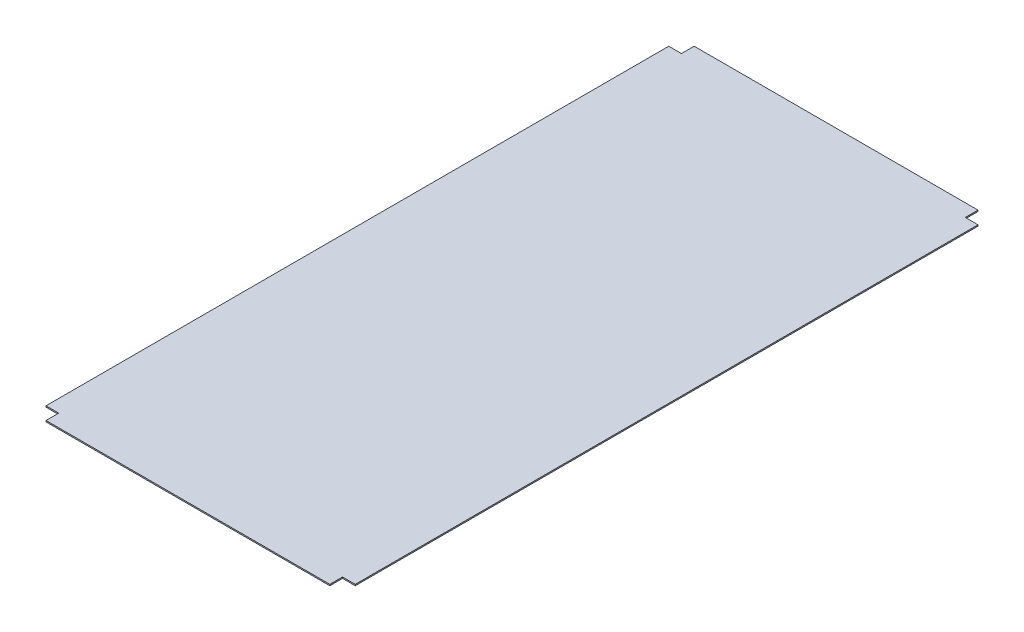
ISO-10303-21;
HEADER;
FILE_DESCRIPTION(('STEP AP214'),'2;1');
FILE_NAME('part.step','',(''),(''),'','','');
FILE_SCHEMA(('AUTOMOTIVE_DESIGN { 1 0 10303 214 1 1 1 1 }'));
ENDSEC;
DATA;
#1=APPLICATION_CONTEXT('core data for automotive mechanical design processes');
#2=APPLICATION_PROTOCOL_DEFINITION('international standard','automotive_design',2000,#1);
#3=PRODUCT_CONTEXT('',#1,'mechanical');
#4=PRODUCT('Part','Part','',(#3));
#5=PRODUCT_RELATED_PRODUCT_CATEGORY('part','',(#4));
#6=PRODUCT_DEFINITION_FORMATION('','',#4);
#7=PRODUCT_DEFINITION_CONTEXT('part definition',#1,'design');
#8=PRODUCT_DEFINITION('design','',#6,#7);
#9=PRODUCT_DEFINITION_SHAPE('','',#8);
#10=(LENGTH_UNIT() NAMED_UNIT(*) SI_UNIT(.MILLI.,.METRE.));
#11=(NAMED_UNIT(*) PLANE_ANGLE_UNIT() SI_UNIT($,.RADIAN.));
#12=(NAMED_UNIT(*) SI_UNIT($,.STERADIAN.) SOLID_ANGLE_UNIT());
#13=UNCERTAINTY_MEASURE_WITH_UNIT(LENGTH_MEASURE(1.E-05),#10,'distance_accuracy_value','');
#14=(GEOMETRIC_REPRESENTATION_CONTEXT(3) GLOBAL_UNCERTAINTY_ASSIGNED_CONTEXT((#13)) GLOBAL_UNIT_ASSIGNED_CONTEXT((#10,
#11,#12)) REPRESENTATION_CONTEXT('',''));
#15=CARTESIAN_POINT('',(0.,0.,0.));
#16=DIRECTION('',(0.,0.,1.));
#17=DIRECTION('',(1.,0.,0.));
#18=AXIS2_PLACEMENT_3D('',#15,#16,#17);
#19=CARTESIAN_POINT('',(365.,3.,765.));
#20=DIRECTION('',(0.,0.,1.));
#21=DIRECTION('',(1.,0.,0.));
#22=AXIS2_PLACEMENT_3D('',#19,#20,#21);
#23=PLANE('',#22);
#24=DIRECTION('',(0.,1.,0.));
#25=VECTOR('',#24,1.);
#26=CARTESIAN_POINT('',(-335.,0.,765.));
#27=LINE('',#26,#25);
#28=CARTESIAN_POINT('',(-335.,0.,765.));
#29=VERTEX_POINT('',#28);
#30=CARTESIAN_POINT('',(-335.,3.,765.));
#31=VERTEX_POINT('',#30);
#32=EDGE_CURVE('E171',#29,#31,#27,.T.);
#33=ORIENTED_EDGE('',*,*,#32,.F.);
#34=DIRECTION('',(-1.,0.,0.));
#35=VECTOR('',#34,1.);
#36=CARTESIAN_POINT('',(365.,0.,765.));
#37=LINE('',#36,#35);
#38=CARTESIAN_POINT('',(335.,0.,765.));
#39=VERTEX_POINT('',#38);
#40=EDGE_CURVE('E203',#39,#29,#37,.T.);
#41=ORIENTED_EDGE('',*,*,#40,.F.);
#42=DIRECTION('',(0.,1.,0.));
#43=VECTOR('',#42,1.);
#44=CARTESIAN_POINT('',(335.,0.,765.));
#45=LINE('',#44,#43);
#46=CARTESIAN_POINT('',(335.,3.,765.));
#47=VERTEX_POINT('',#46);
#48=EDGE_CURVE('E184',#39,#47,#45,.T.);
#49=ORIENTED_EDGE('',*,*,#48,.T.);
#50=DIRECTION('',(-1.,0.,0.));
#51=VECTOR('',#50,1.);
#52=CARTESIAN_POINT('',(365.,3.,765.));
#53=LINE('',#52,#51);
#54=EDGE_CURVE('E207',#47,#31,#53,.T.);
#55=ORIENTED_EDGE('',*,*,#54,.T.);
#56=EDGE_LOOP('',(#33,#41,#49,#55));
#57=FACE_BOUND('',#56,.T.);
#58=ADVANCED_FACE('F44',(#57),#23,.T.);
#59=CARTESIAN_POINT('',(365.,3.,765.));
#60=DIRECTION('',(-1.,0.,0.));
#61=DIRECTION('',(0.,0.,1.));
#62=AXIS2_PLACEMENT_3D('',#59,#60,#61);
#63=PLANE('',#62);
#64=DIRECTION('',(0.,0.,-1.));
#65=VECTOR('',#64,1.);
#66=CARTESIAN_POINT('',(365.,3.,765.));
#67=LINE('',#66,#65);
#68=CARTESIAN_POINT('',(365.,3.,735.));
#69=VERTEX_POINT('',#68);
#70=CARTESIAN_POINT('',(365.,3.,-735.));
#71=VERTEX_POINT('',#70);
#72=EDGE_CURVE('E11',#69,#71,#67,.T.);
#73=ORIENTED_EDGE('',*,*,#72,.F.);
#74=DIRECTION('',(0.,1.,0.));
#75=VECTOR('',#74,1.);
#76=CARTESIAN_POINT('',(365.,0.,735.));
#77=LINE('',#76,#75);
#78=CARTESIAN_POINT('',(365.,0.,735.));
#79=VERTEX_POINT('',#78);
#80=EDGE_CURVE('E168',#79,#69,#77,.T.);
#81=ORIENTED_EDGE('',*,*,#80,.F.);
#82=DIRECTION('',(0.,0.,-1.));
#83=VECTOR('',#82,1.);
#84=CARTESIAN_POINT('',(365.,0.,765.));
#85=LINE('',#84,#83);
#86=CARTESIAN_POINT('',(365.,0.,-735.));
#87=VERTEX_POINT('',#86);
#88=EDGE_CURVE('E47',#79,#87,#85,.T.);
#89=ORIENTED_EDGE('',*,*,#88,.T.);
#90=DIRECTION('',(0.,1.,0.));
#91=VECTOR('',#90,1.);
#92=CARTESIAN_POINT('',(365.,0.,-735.));
#93=LINE('',#92,#91);
#94=EDGE_CURVE('E136',#87,#71,#93,.T.);
#95=ORIENTED_EDGE('',*,*,#94,.T.);
#96=EDGE_LOOP('',(#73,#81,#89,#95));
#97=FACE_BOUND('',#96,.T.);
#98=ADVANCED_FACE('F149',(#97),#63,.F.);
#99=CARTESIAN_POINT('',(365.,3.,-765.));
#100=DIRECTION('',(0.,0.,1.));
#101=DIRECTION('',(1.,0.,0.));
#102=AXIS2_PLACEMENT_3D('',#99,#100,#101);
#103=PLANE('',#102);
#104=DIRECTION('',(-1.,0.,0.));
#105=VECTOR('',#104,1.);
#106=CARTESIAN_POINT('',(365.,3.,-765.));
#107=LINE('',#106,#105);
#108=CARTESIAN_POINT('',(335.,3.,-765.));
#109=VERTEX_POINT('',#108);
#110=CARTESIAN_POINT('',(-335.,3.,-765.));
#111=VERTEX_POINT('',#110);
#112=EDGE_CURVE('E52',#109,#111,#107,.T.);
#113=ORIENTED_EDGE('',*,*,#112,.F.);
#114=DIRECTION('',(0.,1.,0.));
#115=VECTOR('',#114,1.);
#116=CARTESIAN_POINT('',(335.,0.,-765.));
#117=LINE('',#116,#115);
#118=CARTESIAN_POINT('',(335.,0.,-765.));
#119=VERTEX_POINT('',#118);
#120=EDGE_CURVE('E226',#119,#109,#117,.T.);
#121=ORIENTED_EDGE('',*,*,#120,.F.);
#122=DIRECTION('',(-1.,0.,0.));
#123=VECTOR('',#122,1.);
#124=CARTESIAN_POINT('',(365.,0.,-765.));
#125=LINE('',#124,#123);
#126=CARTESIAN_POINT('',(-335.,0.,-765.));
#127=VERTEX_POINT('',#126);
#128=EDGE_CURVE('E219',#119,#127,#125,.T.);
#129=ORIENTED_EDGE('',*,*,#128,.T.);
#130=DIRECTION('',(0.,1.,0.));
#131=VECTOR('',#130,1.);
#132=CARTESIAN_POINT('',(-335.,0.,-765.));
#133=LINE('',#132,#131);
#134=EDGE_CURVE('E200',#127,#111,#133,.T.);
#135=ORIENTED_EDGE('',*,*,#134,.T.);
#136=EDGE_LOOP('',(#113,#121,#129,#135));
#137=FACE_BOUND('',#136,.T.);
#138=ADVANCED_FACE('F225',(#137),#103,.F.);
#139=CARTESIAN_POINT('',(-365.,3.,765.));
#140=DIRECTION('',(-1.,0.,0.));
#141=DIRECTION('',(0.,0.,1.));
#142=AXIS2_PLACEMENT_3D('',#139,#140,#141);
#143=PLANE('',#142);
#144=DIRECTION('',(0.,1.,0.));
#145=VECTOR('',#144,1.);
#146=CARTESIAN_POINT('',(-365.,0.,735.));
#147=LINE('',#146,#145);
#148=CARTESIAN_POINT('',(-365.,0.,735.));
#149=VERTEX_POINT('',#148);
#150=CARTESIAN_POINT('',(-365.,3.,735.));
#151=VERTEX_POINT('',#150);
#152=EDGE_CURVE('E175',#149,#151,#147,.T.);
#153=ORIENTED_EDGE('',*,*,#152,.T.);
#154=DIRECTION('',(0.,0.,-1.));
#155=VECTOR('',#154,1.);
#156=CARTESIAN_POINT('',(-365.,3.,765.));
#157=LINE('',#156,#155);
#158=CARTESIAN_POINT('',(-365.,3.,-735.));
#159=VERTEX_POINT('',#158);
#160=EDGE_CURVE('E210',#151,#159,#157,.T.);
#161=ORIENTED_EDGE('',*,*,#160,.T.);
#162=DIRECTION('',(0.,1.,0.));
#163=VECTOR('',#162,1.);
#164=CARTESIAN_POINT('',(-365.,0.,-735.));
#165=LINE('',#164,#163);
#166=CARTESIAN_POINT('',(-365.,0.,-735.));
#167=VERTEX_POINT('',#166);
#168=EDGE_CURVE('E195',#167,#159,#165,.T.);
#169=ORIENTED_EDGE('',*,*,#168,.F.);
#170=DIRECTION('',(0.,0.,-1.));
#171=VECTOR('',#170,1.);
#172=CARTESIAN_POINT('',(-365.,0.,765.));
#173=LINE('',#172,#171);
#174=EDGE_CURVE('E217',#149,#167,#173,.T.);
#175=ORIENTED_EDGE('',*,*,#174,.F.);
#176=EDGE_LOOP('',(#153,#161,#169,#175));
#177=FACE_BOUND('',#176,.T.);
#178=ADVANCED_FACE('F275',(#177),#143,.T.);
#179=CARTESIAN_POINT('',(0.,3.,0.));
#180=DIRECTION('',(0.,-1.,0.));
#181=DIRECTION('',(0.,0.,-1.));
#182=AXIS2_PLACEMENT_3D('',#179,#180,#181);
#183=PLANE('',#182);
#184=ORIENTED_EDGE('',*,*,#160,.F.);
#185=DIRECTION('',(-1.,0.,0.));
#186=VECTOR('',#185,1.);
#187=CARTESIAN_POINT('',(-365.,3.,735.));
#188=LINE('',#187,#186);
#189=CARTESIAN_POINT('',(-335.,3.,735.));
#190=VERTEX_POINT('',#189);
#191=EDGE_CURVE('E178',#190,#151,#188,.T.);
#192=ORIENTED_EDGE('',*,*,#191,.F.);
#193=DIRECTION('',(0.,0.,-1.));
#194=VECTOR('',#193,1.);
#195=CARTESIAN_POINT('',(-335.,3.,765.));
#196=LINE('',#195,#194);
#197=EDGE_CURVE('E180',#31,#190,#196,.T.);
#198=ORIENTED_EDGE('',*,*,#197,.F.);
#199=ORIENTED_EDGE('',*,*,#54,.F.);
#200=DIRECTION('',(0.,0.,1.));
#201=VECTOR('',#200,1.);
#202=CARTESIAN_POINT('',(335.,3.,765.));
#203=LINE('',#202,#201);
#204=CARTESIAN_POINT('',(335.,3.,735.));
#205=VERTEX_POINT('',#204);
#206=EDGE_CURVE('E160',#205,#47,#203,.T.);
#207=ORIENTED_EDGE('',*,*,#206,.F.);
#208=DIRECTION('',(-1.,0.,0.));
#209=VECTOR('',#208,1.);
#210=CARTESIAN_POINT('',(365.,3.,735.));
#211=LINE('',#210,#209);
#212=EDGE_CURVE('E152',#69,#205,#211,.T.);
#213=ORIENTED_EDGE('',*,*,#212,.F.);
#214=ORIENTED_EDGE('',*,*,#72,.T.);
#215=DIRECTION('',(1.,0.,0.));
#216=VECTOR('',#215,1.);
#217=CARTESIAN_POINT('',(365.,3.,-735.));
#218=LINE('',#217,#216);
#219=CARTESIAN_POINT('',(335.,3.,-735.));
#220=VERTEX_POINT('',#219);
#221=EDGE_CURVE('E133',#220,#71,#218,.T.);
#222=ORIENTED_EDGE('',*,*,#221,.F.);
#223=DIRECTION('',(0.,0.,1.));
#224=VECTOR('',#223,1.);
#225=CARTESIAN_POINT('',(335.,3.,-765.));
#226=LINE('',#225,#224);
#227=EDGE_CURVE('E143',#109,#220,#226,.T.);
#228=ORIENTED_EDGE('',*,*,#227,.F.);
#229=ORIENTED_EDGE('',*,*,#112,.T.);
#230=DIRECTION('',(0.,0.,-1.));
#231=VECTOR('',#230,1.);
#232=CARTESIAN_POINT('',(-335.,3.,-765.));
#233=LINE('',#232,#231);
#234=CARTESIAN_POINT('',(-335.,3.,-735.));
#235=VERTEX_POINT('',#234);
#236=EDGE_CURVE('E192',#235,#111,#233,.T.);
#237=ORIENTED_EDGE('',*,*,#236,.F.);
#238=DIRECTION('',(1.,0.,0.));
#239=VECTOR('',#238,1.);
#240=CARTESIAN_POINT('',(-365.,3.,-735.));
#241=LINE('',#240,#239);
#242=EDGE_CURVE('E196',#159,#235,#241,.T.);
#243=ORIENTED_EDGE('',*,*,#242,.F.);
#244=EDGE_LOOP('',(#184,#192,#198,#199,#207,#213,#214,#222,#228,#229,#237,#243));
#245=FACE_BOUND('',#244,.T.);
#246=ADVANCED_FACE('F156',(#245),#183,.F.);
#247=CARTESIAN_POINT('',(0.,0.,0.));
#248=DIRECTION('',(0.,-1.,0.));
#249=DIRECTION('',(0.,0.,-1.));
#250=AXIS2_PLACEMENT_3D('',#247,#248,#249);
#251=PLANE('',#250);
#252=DIRECTION('',(-1.,0.,0.));
#253=VECTOR('',#252,1.);
#254=CARTESIAN_POINT('',(-365.,0.,735.));
#255=LINE('',#254,#253);
#256=CARTESIAN_POINT('',(-335.,0.,735.));
#257=VERTEX_POINT('',#256);
#258=EDGE_CURVE('E60',#257,#149,#255,.T.);
#259=ORIENTED_EDGE('',*,*,#258,.T.);
#260=ORIENTED_EDGE('',*,*,#174,.T.);
#261=DIRECTION('',(1.,0.,0.));
#262=VECTOR('',#261,1.);
#263=CARTESIAN_POINT('',(-365.,0.,-735.));
#264=LINE('',#263,#262);
#265=CARTESIAN_POINT('',(-335.,0.,-735.));
#266=VERTEX_POINT('',#265);
#267=EDGE_CURVE('E188',#167,#266,#264,.T.);
#268=ORIENTED_EDGE('',*,*,#267,.T.);
#269=DIRECTION('',(0.,0.,-1.));
#270=VECTOR('',#269,1.);
#271=CARTESIAN_POINT('',(-335.,0.,-765.));
#272=LINE('',#271,#270);
#273=EDGE_CURVE('E191',#266,#127,#272,.T.);
#274=ORIENTED_EDGE('',*,*,#273,.T.);
#275=ORIENTED_EDGE('',*,*,#128,.F.);
#276=DIRECTION('',(0.,0.,1.));
#277=VECTOR('',#276,1.);
#278=CARTESIAN_POINT('',(335.,0.,-765.));
#279=LINE('',#278,#277);
#280=CARTESIAN_POINT('',(335.,0.,-735.));
#281=VERTEX_POINT('',#280);
#282=EDGE_CURVE('E144',#119,#281,#279,.T.);
#283=ORIENTED_EDGE('',*,*,#282,.T.);
#284=DIRECTION('',(1.,0.,0.));
#285=VECTOR('',#284,1.);
#286=CARTESIAN_POINT('',(365.,0.,-735.));
#287=LINE('',#286,#285);
#288=EDGE_CURVE('E241',#281,#87,#287,.T.);
#289=ORIENTED_EDGE('',*,*,#288,.T.);
#290=ORIENTED_EDGE('',*,*,#88,.F.);
#291=DIRECTION('',(-1.,0.,0.));
#292=VECTOR('',#291,1.);
#293=CARTESIAN_POINT('',(365.,0.,735.));
#294=LINE('',#293,#292);
#295=CARTESIAN_POINT('',(335.,0.,735.));
#296=VERTEX_POINT('',#295);
#297=EDGE_CURVE('E163',#79,#296,#294,.T.);
#298=ORIENTED_EDGE('',*,*,#297,.T.);
#299=DIRECTION('',(0.,0.,1.));
#300=VECTOR('',#299,1.);
#301=CARTESIAN_POINT('',(335.,0.,765.));
#302=LINE('',#301,#300);
#303=EDGE_CURVE('E68',#296,#39,#302,.T.);
#304=ORIENTED_EDGE('',*,*,#303,.T.);
#305=ORIENTED_EDGE('',*,*,#40,.T.);
#306=DIRECTION('',(0.,0.,-1.));
#307=VECTOR('',#306,1.);
#308=CARTESIAN_POINT('',(-335.,0.,765.));
#309=LINE('',#308,#307);
#310=EDGE_CURVE('E181',#29,#257,#309,.T.);
#311=ORIENTED_EDGE('',*,*,#310,.T.);
#312=EDGE_LOOP('',(#259,#260,#268,#274,#275,#283,#289,#290,#298,#304,#305,#311));
#313=FACE_BOUND('',#312,.T.);
#314=ADVANCED_FACE('F229',(#313),#251,.T.);
#315=CARTESIAN_POINT('',(-335.,0.,-765.));
#316=DIRECTION('',(1.,0.,0.));
#317=DIRECTION('',(0.,0.,-1.));
#318=AXIS2_PLACEMENT_3D('',#315,#316,#317);
#319=PLANE('',#318);
#320=ORIENTED_EDGE('',*,*,#236,.T.);
#321=ORIENTED_EDGE('',*,*,#134,.F.);
#322=ORIENTED_EDGE('',*,*,#273,.F.);
#323=DIRECTION('',(0.,1.,0.));
#324=VECTOR('',#323,1.);
#325=CARTESIAN_POINT('',(-335.,0.,-735.));
#326=LINE('',#325,#324);
#327=EDGE_CURVE('E204',#266,#235,#326,.T.);
#328=ORIENTED_EDGE('',*,*,#327,.T.);
#329=EDGE_LOOP('',(#320,#321,#322,#328));
#330=FACE_BOUND('',#329,.T.);
#331=ADVANCED_FACE('F232',(#330),#319,.F.);
#332=CARTESIAN_POINT('',(-365.,0.,-735.));
#333=DIRECTION('',(0.,0.,1.));
#334=DIRECTION('',(1.,0.,0.));
#335=AXIS2_PLACEMENT_3D('',#332,#333,#334);
#336=PLANE('',#335);
#337=ORIENTED_EDGE('',*,*,#242,.T.);
#338=ORIENTED_EDGE('',*,*,#327,.F.);
#339=ORIENTED_EDGE('',*,*,#267,.F.);
#340=ORIENTED_EDGE('',*,*,#168,.T.);
#341=EDGE_LOOP('',(#337,#338,#339,#340));
#342=FACE_BOUND('',#341,.T.);
#343=ADVANCED_FACE('F234',(#342),#336,.F.);
#344=CARTESIAN_POINT('',(365.,0.,-735.));
#345=DIRECTION('',(0.,0.,1.));
#346=DIRECTION('',(1.,0.,0.));
#347=AXIS2_PLACEMENT_3D('',#344,#345,#346);
#348=PLANE('',#347);
#349=ORIENTED_EDGE('',*,*,#221,.T.);
#350=ORIENTED_EDGE('',*,*,#94,.F.);
#351=ORIENTED_EDGE('',*,*,#288,.F.);
#352=DIRECTION('',(0.,1.,0.));
#353=VECTOR('',#352,1.);
#354=CARTESIAN_POINT('',(335.,0.,-735.));
#355=LINE('',#354,#353);
#356=EDGE_CURVE('E139',#281,#220,#355,.T.);
#357=ORIENTED_EDGE('',*,*,#356,.T.);
#358=EDGE_LOOP('',(#349,#350,#351,#357));
#359=FACE_BOUND('',#358,.T.);
#360=ADVANCED_FACE('F135',(#359),#348,.F.);
#361=CARTESIAN_POINT('',(335.,0.,-765.));
#362=DIRECTION('',(-1.,0.,0.));
#363=DIRECTION('',(0.,0.,1.));
#364=AXIS2_PLACEMENT_3D('',#361,#362,#363);
#365=PLANE('',#364);
#366=ORIENTED_EDGE('',*,*,#227,.T.);
#367=ORIENTED_EDGE('',*,*,#356,.F.);
#368=ORIENTED_EDGE('',*,*,#282,.F.);
#369=ORIENTED_EDGE('',*,*,#120,.T.);
#370=EDGE_LOOP('',(#366,#367,#368,#369));
#371=FACE_BOUND('',#370,.T.);
#372=ADVANCED_FACE('F257',(#371),#365,.F.);
#373=CARTESIAN_POINT('',(335.,0.,765.));
#374=DIRECTION('',(-1.,0.,0.));
#375=DIRECTION('',(0.,0.,1.));
#376=AXIS2_PLACEMENT_3D('',#373,#374,#375);
#377=PLANE('',#376);
#378=ORIENTED_EDGE('',*,*,#206,.T.);
#379=ORIENTED_EDGE('',*,*,#48,.F.);
#380=ORIENTED_EDGE('',*,*,#303,.F.);
#381=DIRECTION('',(0.,1.,0.));
#382=VECTOR('',#381,1.);
#383=CARTESIAN_POINT('',(335.,0.,735.));
#384=LINE('',#383,#382);
#385=EDGE_CURVE('E245',#296,#205,#384,.T.);
#386=ORIENTED_EDGE('',*,*,#385,.T.);
#387=EDGE_LOOP('',(#378,#379,#380,#386));
#388=FACE_BOUND('',#387,.T.);
#389=ADVANCED_FACE('F255',(#388),#377,.F.);
#390=CARTESIAN_POINT('',(365.,0.,735.));
#391=DIRECTION('',(0.,0.,-1.));
#392=DIRECTION('',(-1.,0.,0.));
#393=AXIS2_PLACEMENT_3D('',#390,#391,#392);
#394=PLANE('',#393);
#395=ORIENTED_EDGE('',*,*,#212,.T.);
#396=ORIENTED_EDGE('',*,*,#385,.F.);
#397=ORIENTED_EDGE('',*,*,#297,.F.);
#398=ORIENTED_EDGE('',*,*,#80,.T.);
#399=EDGE_LOOP('',(#395,#396,#397,#398));
#400=FACE_BOUND('',#399,.T.);
#401=ADVANCED_FACE('F254',(#400),#394,.F.);
#402=CARTESIAN_POINT('',(-365.,0.,735.));
#403=DIRECTION('',(0.,0.,-1.));
#404=DIRECTION('',(-1.,0.,0.));
#405=AXIS2_PLACEMENT_3D('',#402,#403,#404);
#406=PLANE('',#405);
#407=ORIENTED_EDGE('',*,*,#191,.T.);
#408=ORIENTED_EDGE('',*,*,#152,.F.);
#409=ORIENTED_EDGE('',*,*,#258,.F.);
#410=DIRECTION('',(0.,1.,0.));
#411=VECTOR('',#410,1.);
#412=CARTESIAN_POINT('',(-335.,0.,735.));
#413=LINE('',#412,#411);
#414=EDGE_CURVE('E173',#257,#190,#413,.T.);
#415=ORIENTED_EDGE('',*,*,#414,.T.);
#416=EDGE_LOOP('',(#407,#408,#409,#415));
#417=FACE_BOUND('',#416,.T.);
#418=ADVANCED_FACE('F263',(#417),#406,.F.);
#419=CARTESIAN_POINT('',(-335.,0.,765.));
#420=DIRECTION('',(1.,0.,0.));
#421=DIRECTION('',(0.,0.,-1.));
#422=AXIS2_PLACEMENT_3D('',#419,#420,#421);
#423=PLANE('',#422);
#424=ORIENTED_EDGE('',*,*,#197,.T.);
#425=ORIENTED_EDGE('',*,*,#414,.F.);
#426=ORIENTED_EDGE('',*,*,#310,.F.);
#427=ORIENTED_EDGE('',*,*,#32,.T.);
#428=EDGE_LOOP('',(#424,#425,#426,#427));
#429=FACE_BOUND('',#428,.T.);
#430=ADVANCED_FACE('F253',(#429),#423,.F.);
#431=CLOSED_SHELL('',(#58,#98,#138,#178,#246,#314,#331,#343,#360,#372,#389,#401,#418,#430));
#432=MANIFOLD_SOLID_BREP('B2',#431);
#433=ADVANCED_BREP_SHAPE_REPRESENTATION('',(#18,#432),#14);
#434=SHAPE_DEFINITION_REPRESENTATION(#9,#433);
ENDSEC;
END-ISO-10303-21;
